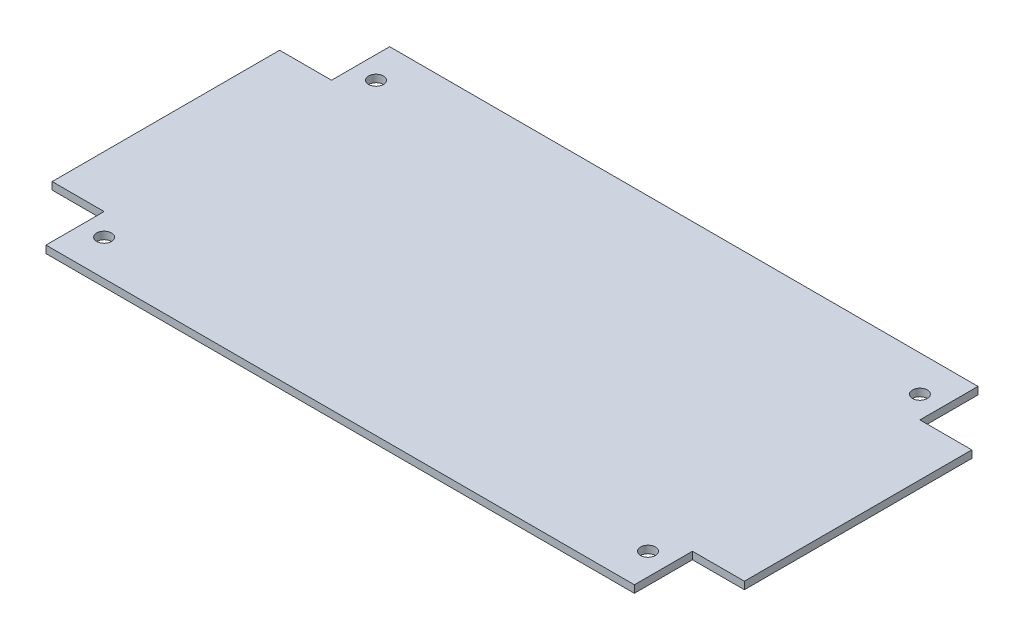
ISO-10303-21;
HEADER;
FILE_DESCRIPTION(('STEP AP214'),'2;1');
FILE_NAME('part.step','',(''),(''),'','','');
FILE_SCHEMA(('AUTOMOTIVE_DESIGN { 1 0 10303 214 1 1 1 1 }'));
ENDSEC;
DATA;
#1=APPLICATION_CONTEXT('core data for automotive mechanical design processes');
#2=APPLICATION_PROTOCOL_DEFINITION('international standard','automotive_design',2000,#1);
#3=PRODUCT_CONTEXT('',#1,'mechanical');
#4=PRODUCT('Part','Part','',(#3));
#5=PRODUCT_RELATED_PRODUCT_CATEGORY('part','',(#4));
#6=PRODUCT_DEFINITION_FORMATION('','',#4);
#7=PRODUCT_DEFINITION_CONTEXT('part definition',#1,'design');
#8=PRODUCT_DEFINITION('design','',#6,#7);
#9=PRODUCT_DEFINITION_SHAPE('','',#8);
#10=(LENGTH_UNIT() NAMED_UNIT(*) SI_UNIT(.MILLI.,.METRE.));
#11=(NAMED_UNIT(*) PLANE_ANGLE_UNIT() SI_UNIT($,.RADIAN.));
#12=(NAMED_UNIT(*) SI_UNIT($,.STERADIAN.) SOLID_ANGLE_UNIT());
#13=UNCERTAINTY_MEASURE_WITH_UNIT(LENGTH_MEASURE(1.E-05),#10,'distance_accuracy_value','');
#14=(GEOMETRIC_REPRESENTATION_CONTEXT(3) GLOBAL_UNCERTAINTY_ASSIGNED_CONTEXT((#13)) GLOBAL_UNIT_ASSIGNED_CONTEXT((#10,
#11,#12)) REPRESENTATION_CONTEXT('',''));
#15=CARTESIAN_POINT('',(0.,0.,0.));
#16=DIRECTION('',(0.,0.,1.));
#17=DIRECTION('',(1.,0.,0.));
#18=AXIS2_PLACEMENT_3D('',#15,#16,#17);
#19=CARTESIAN_POINT('',(0.,1.5,0.));
#20=DIRECTION('',(0.,-1.,0.));
#21=DIRECTION('',(0.,0.,-1.));
#22=AXIS2_PLACEMENT_3D('',#19,#20,#21);
#23=PLANE('',#22);
#24=CARTESIAN_POINT('',(55.,1.5,27.5));
#25=DIRECTION('',(0.,1.,0.));
#26=DIRECTION('',(0.,0.,1.));
#27=AXIS2_PLACEMENT_3D('',#24,#25,#26);
#28=CIRCLE('',#27,1.5);
#29=CARTESIAN_POINT('',(55.,1.5,29.));
#30=VERTEX_POINT('',#29);
#31=EDGE_CURVE('E300',#30,#30,#28,.T.);
#32=ORIENTED_EDGE('',*,*,#31,.F.);
#33=EDGE_LOOP('',(#32));
#34=FACE_BOUND('',#33,.T.);
#35=CARTESIAN_POINT('',(-55.,1.5,-27.5));
#36=DIRECTION('',(0.,1.,0.));
#37=DIRECTION('',(0.,0.,1.));
#38=AXIS2_PLACEMENT_3D('',#35,#36,#37);
#39=CIRCLE('',#38,1.5);
#40=CARTESIAN_POINT('',(-55.,1.5,-26.));
#41=VERTEX_POINT('',#40);
#42=EDGE_CURVE('E165',#41,#41,#39,.T.);
#43=ORIENTED_EDGE('',*,*,#42,.F.);
#44=EDGE_LOOP('',(#43));
#45=FACE_BOUND('',#44,.T.);
#46=DIRECTION('',(0.,0.,1.));
#47=VECTOR('',#46,1.);
#48=CARTESIAN_POINT('',(-59.5,1.5,-23.));
#49=LINE('',#48,#47);
#50=CARTESIAN_POINT('',(-59.5,1.5,-34.75));
#51=VERTEX_POINT('',#50);
#52=CARTESIAN_POINT('',(-59.5,1.5,-23.));
#53=VERTEX_POINT('',#52);
#54=EDGE_CURVE('E185',#51,#53,#49,.T.);
#55=ORIENTED_EDGE('',*,*,#54,.T.);
#56=DIRECTION('',(-1.,0.,0.));
#57=VECTOR('',#56,1.);
#58=CARTESIAN_POINT('',(-70.,1.5,-23.));
#59=LINE('',#58,#57);
#60=CARTESIAN_POINT('',(-70.,1.5,-23.));
#61=VERTEX_POINT('',#60);
#62=EDGE_CURVE('E111',#53,#61,#59,.T.);
#63=ORIENTED_EDGE('',*,*,#62,.T.);
#64=DIRECTION('',(0.,0.,1.));
#65=VECTOR('',#64,1.);
#66=CARTESIAN_POINT('',(-70.,1.5,23.));
#67=LINE('',#66,#65);
#68=CARTESIAN_POINT('',(-70.,1.5,23.));
#69=VERTEX_POINT('',#68);
#70=EDGE_CURVE('E212',#61,#69,#67,.T.);
#71=ORIENTED_EDGE('',*,*,#70,.T.);
#72=DIRECTION('',(1.,0.,0.));
#73=VECTOR('',#72,1.);
#74=CARTESIAN_POINT('',(-59.5,1.5,23.));
#75=LINE('',#74,#73);
#76=CARTESIAN_POINT('',(-59.5,1.5,23.));
#77=VERTEX_POINT('',#76);
#78=EDGE_CURVE('E231',#69,#77,#75,.T.);
#79=ORIENTED_EDGE('',*,*,#78,.T.);
#80=DIRECTION('',(0.,0.,1.));
#81=VECTOR('',#80,1.);
#82=CARTESIAN_POINT('',(-59.5,1.5,34.75));
#83=LINE('',#82,#81);
#84=CARTESIAN_POINT('',(-59.5,1.5,34.75));
#85=VERTEX_POINT('',#84);
#86=EDGE_CURVE('E228',#77,#85,#83,.T.);
#87=ORIENTED_EDGE('',*,*,#86,.T.);
#88=DIRECTION('',(1.,0.,0.));
#89=VECTOR('',#88,1.);
#90=CARTESIAN_POINT('',(59.5,1.5,34.75));
#91=LINE('',#90,#89);
#92=CARTESIAN_POINT('',(59.5,1.5,34.75));
#93=VERTEX_POINT('',#92);
#94=EDGE_CURVE('E230',#85,#93,#91,.T.);
#95=ORIENTED_EDGE('',*,*,#94,.T.);
#96=DIRECTION('',(0.,0.,-1.));
#97=VECTOR('',#96,1.);
#98=CARTESIAN_POINT('',(59.5,1.5,23.));
#99=LINE('',#98,#97);
#100=CARTESIAN_POINT('',(59.5,1.5,23.));
#101=VERTEX_POINT('',#100);
#102=EDGE_CURVE('E233',#93,#101,#99,.T.);
#103=ORIENTED_EDGE('',*,*,#102,.T.);
#104=DIRECTION('',(1.,0.,0.));
#105=VECTOR('',#104,1.);
#106=CARTESIAN_POINT('',(70.,1.5,23.));
#107=LINE('',#106,#105);
#108=CARTESIAN_POINT('',(70.,1.5,23.));
#109=VERTEX_POINT('',#108);
#110=EDGE_CURVE('E239',#101,#109,#107,.T.);
#111=ORIENTED_EDGE('',*,*,#110,.T.);
#112=DIRECTION('',(0.,0.,-1.));
#113=VECTOR('',#112,1.);
#114=CARTESIAN_POINT('',(70.,1.5,-23.));
#115=LINE('',#114,#113);
#116=CARTESIAN_POINT('',(70.,1.5,-23.));
#117=VERTEX_POINT('',#116);
#118=EDGE_CURVE('E142',#109,#117,#115,.T.);
#119=ORIENTED_EDGE('',*,*,#118,.T.);
#120=DIRECTION('',(-1.,0.,0.));
#121=VECTOR('',#120,1.);
#122=CARTESIAN_POINT('',(59.5,1.5,-23.));
#123=LINE('',#122,#121);
#124=CARTESIAN_POINT('',(59.5,1.5,-23.));
#125=VERTEX_POINT('',#124);
#126=EDGE_CURVE('E136',#117,#125,#123,.T.);
#127=ORIENTED_EDGE('',*,*,#126,.T.);
#128=DIRECTION('',(0.,0.,-1.));
#129=VECTOR('',#128,1.);
#130=CARTESIAN_POINT('',(59.5,1.5,-34.75));
#131=LINE('',#130,#129);
#132=CARTESIAN_POINT('',(59.5,1.5,-34.75));
#133=VERTEX_POINT('',#132);
#134=EDGE_CURVE('E140',#125,#133,#131,.T.);
#135=ORIENTED_EDGE('',*,*,#134,.T.);
#136=DIRECTION('',(-1.,0.,0.));
#137=VECTOR('',#136,1.);
#138=CARTESIAN_POINT('',(-59.5,1.5,-34.75));
#139=LINE('',#138,#137);
#140=EDGE_CURVE('E56',#133,#51,#139,.T.);
#141=ORIENTED_EDGE('',*,*,#140,.T.);
#142=EDGE_LOOP('',(#55,#63,#71,#79,#87,#95,#103,#111,#119,#127,#135,#141));
#143=FACE_BOUND('',#142,.T.);
#144=CARTESIAN_POINT('',(-55.,1.5,27.5));
#145=DIRECTION('',(0.,1.,0.));
#146=DIRECTION('',(0.,0.,1.));
#147=AXIS2_PLACEMENT_3D('',#144,#145,#146);
#148=CIRCLE('',#147,1.5);
#149=CARTESIAN_POINT('',(-55.,1.5,29.));
#150=VERTEX_POINT('',#149);
#151=EDGE_CURVE('E306',#150,#150,#148,.T.);
#152=ORIENTED_EDGE('',*,*,#151,.F.);
#153=EDGE_LOOP('',(#152));
#154=FACE_BOUND('',#153,.T.);
#155=CARTESIAN_POINT('',(55.,1.5,-27.5));
#156=DIRECTION('',(0.,1.,0.));
#157=DIRECTION('',(0.,0.,1.));
#158=AXIS2_PLACEMENT_3D('',#155,#156,#157);
#159=CIRCLE('',#158,1.5);
#160=CARTESIAN_POINT('',(55.,1.5,-26.));
#161=VERTEX_POINT('',#160);
#162=EDGE_CURVE('E291',#161,#161,#159,.T.);
#163=ORIENTED_EDGE('',*,*,#162,.F.);
#164=EDGE_LOOP('',(#163));
#165=FACE_BOUND('',#164,.T.);
#166=ADVANCED_FACE('F39',(#34,#45,#143,#154,#165),#23,.F.);
#167=CARTESIAN_POINT('',(0.,0.,0.));
#168=DIRECTION('',(0.,-1.,0.));
#169=DIRECTION('',(0.,0.,-1.));
#170=AXIS2_PLACEMENT_3D('',#167,#168,#169);
#171=PLANE('',#170);
#172=CARTESIAN_POINT('',(55.,0.,27.5));
#173=DIRECTION('',(0.,1.,0.));
#174=DIRECTION('',(0.,0.,1.));
#175=AXIS2_PLACEMENT_3D('',#172,#173,#174);
#176=CIRCLE('',#175,1.5);
#177=CARTESIAN_POINT('',(55.,0.,29.));
#178=VERTEX_POINT('',#177);
#179=EDGE_CURVE('E297',#178,#178,#176,.T.);
#180=ORIENTED_EDGE('',*,*,#179,.T.);
#181=EDGE_LOOP('',(#180));
#182=FACE_BOUND('',#181,.T.);
#183=CARTESIAN_POINT('',(-55.,0.,-27.5));
#184=DIRECTION('',(0.,1.,0.));
#185=DIRECTION('',(0.,0.,1.));
#186=AXIS2_PLACEMENT_3D('',#183,#184,#185);
#187=CIRCLE('',#186,1.5);
#188=CARTESIAN_POINT('',(-55.,0.,-26.));
#189=VERTEX_POINT('',#188);
#190=EDGE_CURVE('E309',#189,#189,#187,.T.);
#191=ORIENTED_EDGE('',*,*,#190,.T.);
#192=EDGE_LOOP('',(#191));
#193=FACE_BOUND('',#192,.T.);
#194=DIRECTION('',(0.,0.,1.));
#195=VECTOR('',#194,1.);
#196=CARTESIAN_POINT('',(-59.5,0.,-23.));
#197=LINE('',#196,#195);
#198=CARTESIAN_POINT('',(-59.5,0.,-34.75));
#199=VERTEX_POINT('',#198);
#200=CARTESIAN_POINT('',(-59.5,0.,-23.));
#201=VERTEX_POINT('',#200);
#202=EDGE_CURVE('E161',#199,#201,#197,.T.);
#203=ORIENTED_EDGE('',*,*,#202,.F.);
#204=DIRECTION('',(-1.,0.,0.));
#205=VECTOR('',#204,1.);
#206=CARTESIAN_POINT('',(-59.5,0.,-34.75));
#207=LINE('',#206,#205);
#208=CARTESIAN_POINT('',(59.5,0.,-34.75));
#209=VERTEX_POINT('',#208);
#210=EDGE_CURVE('E103',#209,#199,#207,.T.);
#211=ORIENTED_EDGE('',*,*,#210,.F.);
#212=DIRECTION('',(0.,0.,-1.));
#213=VECTOR('',#212,1.);
#214=CARTESIAN_POINT('',(59.5,0.,-34.75));
#215=LINE('',#214,#213);
#216=CARTESIAN_POINT('',(59.5,0.,-23.));
#217=VERTEX_POINT('',#216);
#218=EDGE_CURVE('E97',#217,#209,#215,.T.);
#219=ORIENTED_EDGE('',*,*,#218,.F.);
#220=DIRECTION('',(-1.,0.,0.));
#221=VECTOR('',#220,1.);
#222=CARTESIAN_POINT('',(59.5,0.,-23.));
#223=LINE('',#222,#221);
#224=CARTESIAN_POINT('',(70.,0.,-23.));
#225=VERTEX_POINT('',#224);
#226=EDGE_CURVE('E150',#225,#217,#223,.T.);
#227=ORIENTED_EDGE('',*,*,#226,.F.);
#228=DIRECTION('',(0.,0.,-1.));
#229=VECTOR('',#228,1.);
#230=CARTESIAN_POINT('',(70.,0.,-23.));
#231=LINE('',#230,#229);
#232=CARTESIAN_POINT('',(70.,0.,23.));
#233=VERTEX_POINT('',#232);
#234=EDGE_CURVE('E179',#233,#225,#231,.T.);
#235=ORIENTED_EDGE('',*,*,#234,.F.);
#236=DIRECTION('',(1.,0.,0.));
#237=VECTOR('',#236,1.);
#238=CARTESIAN_POINT('',(70.,0.,23.));
#239=LINE('',#238,#237);
#240=CARTESIAN_POINT('',(59.5,0.,23.));
#241=VERTEX_POINT('',#240);
#242=EDGE_CURVE('E177',#241,#233,#239,.T.);
#243=ORIENTED_EDGE('',*,*,#242,.F.);
#244=DIRECTION('',(0.,0.,-1.));
#245=VECTOR('',#244,1.);
#246=CARTESIAN_POINT('',(59.5,0.,23.));
#247=LINE('',#246,#245);
#248=CARTESIAN_POINT('',(59.5,0.,34.75));
#249=VERTEX_POINT('',#248);
#250=EDGE_CURVE('E175',#249,#241,#247,.T.);
#251=ORIENTED_EDGE('',*,*,#250,.F.);
#252=DIRECTION('',(1.,0.,0.));
#253=VECTOR('',#252,1.);
#254=CARTESIAN_POINT('',(59.5,0.,34.75));
#255=LINE('',#254,#253);
#256=CARTESIAN_POINT('',(-59.5,0.,34.75));
#257=VERTEX_POINT('',#256);
#258=EDGE_CURVE('E173',#257,#249,#255,.T.);
#259=ORIENTED_EDGE('',*,*,#258,.F.);
#260=DIRECTION('',(0.,0.,1.));
#261=VECTOR('',#260,1.);
#262=CARTESIAN_POINT('',(-59.5,0.,34.75));
#263=LINE('',#262,#261);
#264=CARTESIAN_POINT('',(-59.5,0.,23.));
#265=VERTEX_POINT('',#264);
#266=EDGE_CURVE('E171',#265,#257,#263,.T.);
#267=ORIENTED_EDGE('',*,*,#266,.F.);
#268=DIRECTION('',(1.,0.,0.));
#269=VECTOR('',#268,1.);
#270=CARTESIAN_POINT('',(-59.5,0.,23.));
#271=LINE('',#270,#269);
#272=CARTESIAN_POINT('',(-70.,0.,23.));
#273=VERTEX_POINT('',#272);
#274=EDGE_CURVE('E169',#273,#265,#271,.T.);
#275=ORIENTED_EDGE('',*,*,#274,.F.);
#276=DIRECTION('',(0.,0.,1.));
#277=VECTOR('',#276,1.);
#278=CARTESIAN_POINT('',(-70.,0.,23.));
#279=LINE('',#278,#277);
#280=CARTESIAN_POINT('',(-70.,0.,-23.));
#281=VERTEX_POINT('',#280);
#282=EDGE_CURVE('E167',#281,#273,#279,.T.);
#283=ORIENTED_EDGE('',*,*,#282,.F.);
#284=DIRECTION('',(-1.,0.,0.));
#285=VECTOR('',#284,1.);
#286=CARTESIAN_POINT('',(-70.,0.,-23.));
#287=LINE('',#286,#285);
#288=EDGE_CURVE('E164',#201,#281,#287,.T.);
#289=ORIENTED_EDGE('',*,*,#288,.F.);
#290=EDGE_LOOP('',(#203,#211,#219,#227,#235,#243,#251,#259,#267,#275,#283,#289));
#291=FACE_BOUND('',#290,.T.);
#292=CARTESIAN_POINT('',(-55.,0.,27.5));
#293=DIRECTION('',(0.,1.,0.));
#294=DIRECTION('',(0.,0.,1.));
#295=AXIS2_PLACEMENT_3D('',#292,#293,#294);
#296=CIRCLE('',#295,1.5);
#297=CARTESIAN_POINT('',(-55.,0.,29.));
#298=VERTEX_POINT('',#297);
#299=EDGE_CURVE('E303',#298,#298,#296,.T.);
#300=ORIENTED_EDGE('',*,*,#299,.T.);
#301=EDGE_LOOP('',(#300));
#302=FACE_BOUND('',#301,.T.);
#303=CARTESIAN_POINT('',(55.,0.,-27.5));
#304=DIRECTION('',(0.,1.,0.));
#305=DIRECTION('',(0.,0.,1.));
#306=AXIS2_PLACEMENT_3D('',#303,#304,#305);
#307=CIRCLE('',#306,1.5);
#308=CARTESIAN_POINT('',(55.,0.,-26.));
#309=VERTEX_POINT('',#308);
#310=EDGE_CURVE('E294',#309,#309,#307,.T.);
#311=ORIENTED_EDGE('',*,*,#310,.T.);
#312=EDGE_LOOP('',(#311));
#313=FACE_BOUND('',#312,.T.);
#314=ADVANCED_FACE('F216',(#182,#193,#291,#302,#313),#171,.T.);
#315=CARTESIAN_POINT('',(-59.5,1.5,-23.));
#316=DIRECTION('',(1.,0.,0.));
#317=DIRECTION('',(0.,0.,-1.));
#318=AXIS2_PLACEMENT_3D('',#315,#316,#317);
#319=PLANE('',#318);
#320=ORIENTED_EDGE('',*,*,#202,.T.);
#321=DIRECTION('',(0.,-1.,0.));
#322=VECTOR('',#321,1.);
#323=CARTESIAN_POINT('',(-59.5,1.5,-23.));
#324=LINE('',#323,#322);
#325=EDGE_CURVE('E11',#53,#201,#324,.T.);
#326=ORIENTED_EDGE('',*,*,#325,.F.);
#327=ORIENTED_EDGE('',*,*,#54,.F.);
#328=DIRECTION('',(0.,-1.,0.));
#329=VECTOR('',#328,1.);
#330=CARTESIAN_POINT('',(-59.5,1.5,-34.75));
#331=LINE('',#330,#329);
#332=EDGE_CURVE('E157',#51,#199,#331,.T.);
#333=ORIENTED_EDGE('',*,*,#332,.T.);
#334=EDGE_LOOP('',(#320,#326,#327,#333));
#335=FACE_BOUND('',#334,.T.);
#336=ADVANCED_FACE('F41',(#335),#319,.F.);
#337=CARTESIAN_POINT('',(-70.,1.5,-23.));
#338=DIRECTION('',(0.,0.,1.));
#339=DIRECTION('',(1.,0.,0.));
#340=AXIS2_PLACEMENT_3D('',#337,#338,#339);
#341=PLANE('',#340);
#342=ORIENTED_EDGE('',*,*,#288,.T.);
#343=DIRECTION('',(0.,-1.,0.));
#344=VECTOR('',#343,1.);
#345=CARTESIAN_POINT('',(-70.,1.5,-23.));
#346=LINE('',#345,#344);
#347=EDGE_CURVE('E48',#61,#281,#346,.T.);
#348=ORIENTED_EDGE('',*,*,#347,.F.);
#349=ORIENTED_EDGE('',*,*,#62,.F.);
#350=ORIENTED_EDGE('',*,*,#325,.T.);
#351=EDGE_LOOP('',(#342,#348,#349,#350));
#352=FACE_BOUND('',#351,.T.);
#353=ADVANCED_FACE('F431',(#352),#341,.F.);
#354=CARTESIAN_POINT('',(-70.,1.5,23.));
#355=DIRECTION('',(1.,0.,0.));
#356=DIRECTION('',(0.,0.,-1.));
#357=AXIS2_PLACEMENT_3D('',#354,#355,#356);
#358=PLANE('',#357);
#359=ORIENTED_EDGE('',*,*,#282,.T.);
#360=DIRECTION('',(0.,-1.,0.));
#361=VECTOR('',#360,1.);
#362=CARTESIAN_POINT('',(-70.,1.5,23.));
#363=LINE('',#362,#361);
#364=EDGE_CURVE('E204',#69,#273,#363,.T.);
#365=ORIENTED_EDGE('',*,*,#364,.F.);
#366=ORIENTED_EDGE('',*,*,#70,.F.);
#367=ORIENTED_EDGE('',*,*,#347,.T.);
#368=EDGE_LOOP('',(#359,#365,#366,#367));
#369=FACE_BOUND('',#368,.T.);
#370=ADVANCED_FACE('F210',(#369),#358,.F.);
#371=CARTESIAN_POINT('',(-59.5,1.5,23.));
#372=DIRECTION('',(0.,0.,-1.));
#373=DIRECTION('',(-1.,0.,0.));
#374=AXIS2_PLACEMENT_3D('',#371,#372,#373);
#375=PLANE('',#374);
#376=ORIENTED_EDGE('',*,*,#274,.T.);
#377=DIRECTION('',(0.,-1.,0.));
#378=VECTOR('',#377,1.);
#379=CARTESIAN_POINT('',(-59.5,1.5,23.));
#380=LINE('',#379,#378);
#381=EDGE_CURVE('E201',#77,#265,#380,.T.);
#382=ORIENTED_EDGE('',*,*,#381,.F.);
#383=ORIENTED_EDGE('',*,*,#78,.F.);
#384=ORIENTED_EDGE('',*,*,#364,.T.);
#385=EDGE_LOOP('',(#376,#382,#383,#384));
#386=FACE_BOUND('',#385,.T.);
#387=ADVANCED_FACE('F222',(#386),#375,.F.);
#388=CARTESIAN_POINT('',(-59.5,1.5,34.75));
#389=DIRECTION('',(1.,0.,0.));
#390=DIRECTION('',(0.,0.,-1.));
#391=AXIS2_PLACEMENT_3D('',#388,#389,#390);
#392=PLANE('',#391);
#393=ORIENTED_EDGE('',*,*,#266,.T.);
#394=DIRECTION('',(0.,-1.,0.));
#395=VECTOR('',#394,1.);
#396=CARTESIAN_POINT('',(-59.5,1.5,34.75));
#397=LINE('',#396,#395);
#398=EDGE_CURVE('E198',#85,#257,#397,.T.);
#399=ORIENTED_EDGE('',*,*,#398,.F.);
#400=ORIENTED_EDGE('',*,*,#86,.F.);
#401=ORIENTED_EDGE('',*,*,#381,.T.);
#402=EDGE_LOOP('',(#393,#399,#400,#401));
#403=FACE_BOUND('',#402,.T.);
#404=ADVANCED_FACE('F226',(#403),#392,.F.);
#405=CARTESIAN_POINT('',(59.5,1.5,34.75));
#406=DIRECTION('',(0.,0.,-1.));
#407=DIRECTION('',(-1.,0.,0.));
#408=AXIS2_PLACEMENT_3D('',#405,#406,#407);
#409=PLANE('',#408);
#410=ORIENTED_EDGE('',*,*,#258,.T.);
#411=DIRECTION('',(0.,-1.,0.));
#412=VECTOR('',#411,1.);
#413=CARTESIAN_POINT('',(59.5,1.5,34.75));
#414=LINE('',#413,#412);
#415=EDGE_CURVE('E195',#93,#249,#414,.T.);
#416=ORIENTED_EDGE('',*,*,#415,.F.);
#417=ORIENTED_EDGE('',*,*,#94,.F.);
#418=ORIENTED_EDGE('',*,*,#398,.T.);
#419=EDGE_LOOP('',(#410,#416,#417,#418));
#420=FACE_BOUND('',#419,.T.);
#421=ADVANCED_FACE('F396',(#420),#409,.F.);
#422=CARTESIAN_POINT('',(59.5,1.5,23.));
#423=DIRECTION('',(-1.,0.,0.));
#424=DIRECTION('',(0.,0.,1.));
#425=AXIS2_PLACEMENT_3D('',#422,#423,#424);
#426=PLANE('',#425);
#427=ORIENTED_EDGE('',*,*,#250,.T.);
#428=DIRECTION('',(0.,-1.,0.));
#429=VECTOR('',#428,1.);
#430=CARTESIAN_POINT('',(59.5,1.5,23.));
#431=LINE('',#430,#429);
#432=EDGE_CURVE('E192',#101,#241,#431,.T.);
#433=ORIENTED_EDGE('',*,*,#432,.F.);
#434=ORIENTED_EDGE('',*,*,#102,.F.);
#435=ORIENTED_EDGE('',*,*,#415,.T.);
#436=EDGE_LOOP('',(#427,#433,#434,#435));
#437=FACE_BOUND('',#436,.T.);
#438=ADVANCED_FACE('F387',(#437),#426,.F.);
#439=CARTESIAN_POINT('',(70.,1.5,23.));
#440=DIRECTION('',(0.,0.,-1.));
#441=DIRECTION('',(-1.,0.,0.));
#442=AXIS2_PLACEMENT_3D('',#439,#440,#441);
#443=PLANE('',#442);
#444=ORIENTED_EDGE('',*,*,#242,.T.);
#445=DIRECTION('',(0.,-1.,0.));
#446=VECTOR('',#445,1.);
#447=CARTESIAN_POINT('',(70.,1.5,23.));
#448=LINE('',#447,#446);
#449=EDGE_CURVE('E189',#109,#233,#448,.T.);
#450=ORIENTED_EDGE('',*,*,#449,.F.);
#451=ORIENTED_EDGE('',*,*,#110,.F.);
#452=ORIENTED_EDGE('',*,*,#432,.T.);
#453=EDGE_LOOP('',(#444,#450,#451,#452));
#454=FACE_BOUND('',#453,.T.);
#455=ADVANCED_FACE('F245',(#454),#443,.F.);
#456=CARTESIAN_POINT('',(70.,1.5,-23.));
#457=DIRECTION('',(-1.,0.,0.));
#458=DIRECTION('',(0.,0.,1.));
#459=AXIS2_PLACEMENT_3D('',#456,#457,#458);
#460=PLANE('',#459);
#461=ORIENTED_EDGE('',*,*,#234,.T.);
#462=DIRECTION('',(0.,-1.,0.));
#463=VECTOR('',#462,1.);
#464=CARTESIAN_POINT('',(70.,1.5,-23.));
#465=LINE('',#464,#463);
#466=EDGE_CURVE('E151',#117,#225,#465,.T.);
#467=ORIENTED_EDGE('',*,*,#466,.F.);
#468=ORIENTED_EDGE('',*,*,#118,.F.);
#469=ORIENTED_EDGE('',*,*,#449,.T.);
#470=EDGE_LOOP('',(#461,#467,#468,#469));
#471=FACE_BOUND('',#470,.T.);
#472=ADVANCED_FACE('F249',(#471),#460,.F.);
#473=CARTESIAN_POINT('',(59.5,1.5,-23.));
#474=DIRECTION('',(0.,0.,1.));
#475=DIRECTION('',(1.,0.,0.));
#476=AXIS2_PLACEMENT_3D('',#473,#474,#475);
#477=PLANE('',#476);
#478=ORIENTED_EDGE('',*,*,#226,.T.);
#479=DIRECTION('',(0.,-1.,0.));
#480=VECTOR('',#479,1.);
#481=CARTESIAN_POINT('',(59.5,1.5,-23.));
#482=LINE('',#481,#480);
#483=EDGE_CURVE('E147',#125,#217,#482,.T.);
#484=ORIENTED_EDGE('',*,*,#483,.F.);
#485=ORIENTED_EDGE('',*,*,#126,.F.);
#486=ORIENTED_EDGE('',*,*,#466,.T.);
#487=EDGE_LOOP('',(#478,#484,#485,#486));
#488=FACE_BOUND('',#487,.T.);
#489=ADVANCED_FACE('F148',(#488),#477,.F.);
#490=CARTESIAN_POINT('',(59.5,1.5,-34.75));
#491=DIRECTION('',(-1.,0.,0.));
#492=DIRECTION('',(0.,0.,1.));
#493=AXIS2_PLACEMENT_3D('',#490,#491,#492);
#494=PLANE('',#493);
#495=ORIENTED_EDGE('',*,*,#218,.T.);
#496=DIRECTION('',(0.,-1.,0.));
#497=VECTOR('',#496,1.);
#498=CARTESIAN_POINT('',(59.5,1.5,-34.75));
#499=LINE('',#498,#497);
#500=EDGE_CURVE('E152',#133,#209,#499,.T.);
#501=ORIENTED_EDGE('',*,*,#500,.F.);
#502=ORIENTED_EDGE('',*,*,#134,.F.);
#503=ORIENTED_EDGE('',*,*,#483,.T.);
#504=EDGE_LOOP('',(#495,#501,#502,#503));
#505=FACE_BOUND('',#504,.T.);
#506=ADVANCED_FACE('F154',(#505),#494,.F.);
#507=CARTESIAN_POINT('',(-59.5,1.5,-34.75));
#508=DIRECTION('',(0.,0.,1.));
#509=DIRECTION('',(1.,0.,0.));
#510=AXIS2_PLACEMENT_3D('',#507,#508,#509);
#511=PLANE('',#510);
#512=ORIENTED_EDGE('',*,*,#210,.T.);
#513=ORIENTED_EDGE('',*,*,#332,.F.);
#514=ORIENTED_EDGE('',*,*,#140,.F.);
#515=ORIENTED_EDGE('',*,*,#500,.T.);
#516=EDGE_LOOP('',(#512,#513,#514,#515));
#517=FACE_BOUND('',#516,.T.);
#518=ADVANCED_FACE('F253',(#517),#511,.F.);
#519=CARTESIAN_POINT('',(-55.,1.5,-27.5));
#520=DIRECTION('',(0.,-1.,0.));
#521=DIRECTION('',(0.,0.,-1.));
#522=AXIS2_PLACEMENT_3D('',#519,#520,#521);
#523=CYLINDRICAL_SURFACE('',#522,1.5);
#524=ORIENTED_EDGE('',*,*,#42,.T.);
#525=EDGE_LOOP('',(#524));
#526=FACE_BOUND('',#525,.T.);
#527=ORIENTED_EDGE('',*,*,#190,.F.);
#528=EDGE_LOOP('',(#527));
#529=FACE_BOUND('',#528,.T.);
#530=ADVANCED_FACE('F255',(#526,#529),#523,.F.);
#531=CARTESIAN_POINT('',(-55.,1.5,27.5));
#532=DIRECTION('',(0.,-1.,0.));
#533=DIRECTION('',(0.,0.,-1.));
#534=AXIS2_PLACEMENT_3D('',#531,#532,#533);
#535=CYLINDRICAL_SURFACE('',#534,1.5);
#536=ORIENTED_EDGE('',*,*,#151,.T.);
#537=EDGE_LOOP('',(#536));
#538=FACE_BOUND('',#537,.T.);
#539=ORIENTED_EDGE('',*,*,#299,.F.);
#540=EDGE_LOOP('',(#539));
#541=FACE_BOUND('',#540,.T.);
#542=ADVANCED_FACE('F261',(#538,#541),#535,.F.);
#543=CARTESIAN_POINT('',(55.,1.5,27.5));
#544=DIRECTION('',(0.,-1.,0.));
#545=DIRECTION('',(0.,0.,-1.));
#546=AXIS2_PLACEMENT_3D('',#543,#544,#545);
#547=CYLINDRICAL_SURFACE('',#546,1.5);
#548=ORIENTED_EDGE('',*,*,#31,.T.);
#549=EDGE_LOOP('',(#548));
#550=FACE_BOUND('',#549,.T.);
#551=ORIENTED_EDGE('',*,*,#179,.F.);
#552=EDGE_LOOP('',(#551));
#553=FACE_BOUND('',#552,.T.);
#554=ADVANCED_FACE('F278',(#550,#553),#547,.F.);
#555=CARTESIAN_POINT('',(55.,1.5,-27.5));
#556=DIRECTION('',(0.,-1.,0.));
#557=DIRECTION('',(0.,0.,-1.));
#558=AXIS2_PLACEMENT_3D('',#555,#556,#557);
#559=CYLINDRICAL_SURFACE('',#558,1.5);
#560=ORIENTED_EDGE('',*,*,#162,.T.);
#561=EDGE_LOOP('',(#560));
#562=FACE_BOUND('',#561,.T.);
#563=ORIENTED_EDGE('',*,*,#310,.F.);
#564=EDGE_LOOP('',(#563));
#565=FACE_BOUND('',#564,.T.);
#566=ADVANCED_FACE('F282',(#562,#565),#559,.F.);
#567=CLOSED_SHELL('',(#166,#314,#336,#353,#370,#387,#404,#421,#438,#455,#472,#489,#506,#518,
#530,#542,#554,#566));
#568=MANIFOLD_SOLID_BREP('B2',#567);
#569=ADVANCED_BREP_SHAPE_REPRESENTATION('',(#18,#568),#14);
#570=SHAPE_DEFINITION_REPRESENTATION(#9,#569);
ENDSEC;
END-ISO-10303-21;
